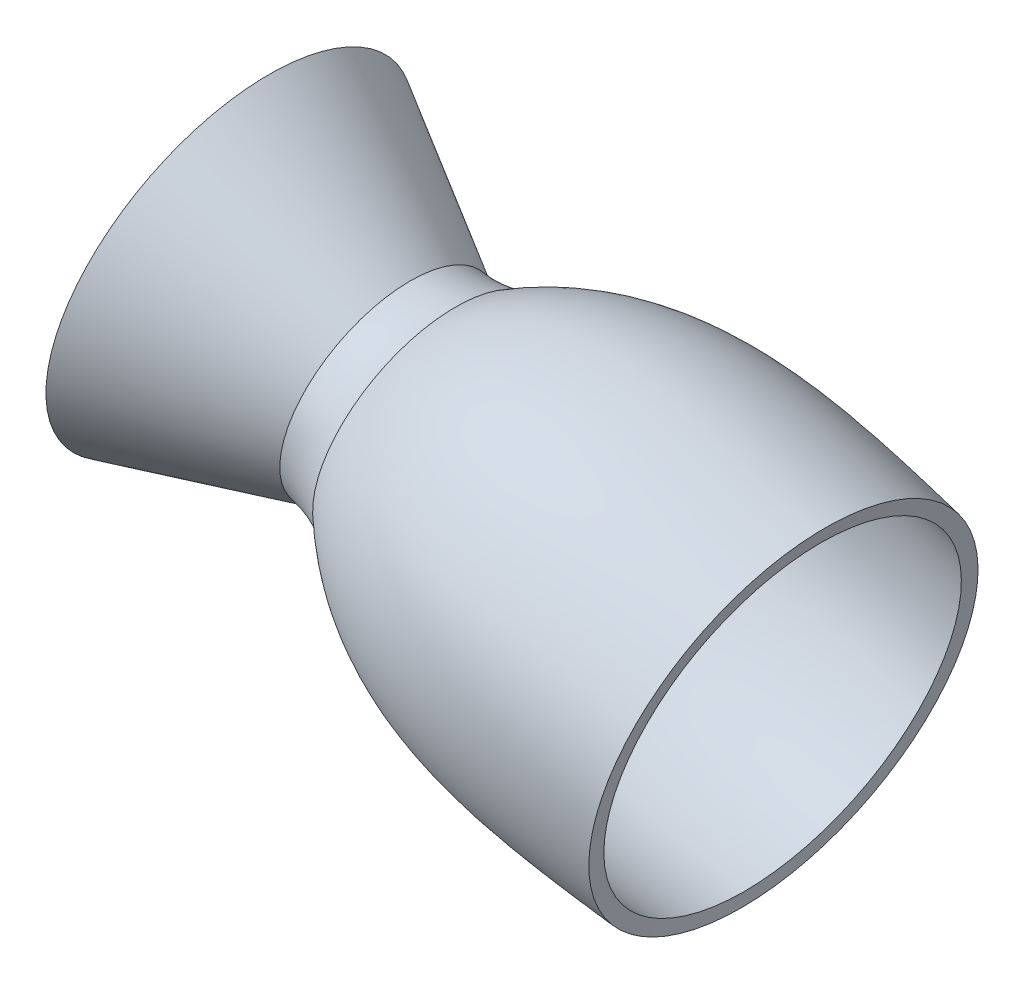
ISO-10303-21;
HEADER;
FILE_DESCRIPTION(('STEP AP214'),'2;1');
FILE_NAME('part.step','',(''),(''),'','','');
FILE_SCHEMA(('AUTOMOTIVE_DESIGN { 1 0 10303 214 1 1 1 1 }'));
ENDSEC;
DATA;
#1=APPLICATION_CONTEXT('core data for automotive mechanical design processes');
#2=APPLICATION_PROTOCOL_DEFINITION('international standard','automotive_design',2000,#1);
#3=PRODUCT_CONTEXT('',#1,'mechanical');
#4=PRODUCT('Part','Part','',(#3));
#5=PRODUCT_RELATED_PRODUCT_CATEGORY('part','',(#4));
#6=PRODUCT_DEFINITION_FORMATION('','',#4);
#7=PRODUCT_DEFINITION_CONTEXT('part definition',#1,'design');
#8=PRODUCT_DEFINITION('design','',#6,#7);
#9=PRODUCT_DEFINITION_SHAPE('','',#8);
#10=(LENGTH_UNIT() NAMED_UNIT(*) SI_UNIT(.MILLI.,.METRE.));
#11=(NAMED_UNIT(*) PLANE_ANGLE_UNIT() SI_UNIT($,.RADIAN.));
#12=(NAMED_UNIT(*) SI_UNIT($,.STERADIAN.) SOLID_ANGLE_UNIT());
#13=UNCERTAINTY_MEASURE_WITH_UNIT(LENGTH_MEASURE(1.E-05),#10,'distance_accuracy_value','');
#14=(GEOMETRIC_REPRESENTATION_CONTEXT(3) GLOBAL_UNCERTAINTY_ASSIGNED_CONTEXT((#13)) GLOBAL_UNIT_ASSIGNED_CONTEXT((#10,
#11,#12)) REPRESENTATION_CONTEXT('',''));
#15=CARTESIAN_POINT('',(0.,0.,0.));
#16=DIRECTION('',(0.,0.,1.));
#17=DIRECTION('',(1.,0.,0.));
#18=AXIS2_PLACEMENT_3D('',#15,#16,#17);
#19=CARTESIAN_POINT('',(357.166240612997,64.8337648435883,0.));
#20=CARTESIAN_POINT('',(241.601433893116,97.48957870662,0.));
#21=CARTESIAN_POINT('',(117.631064711217,135.248700164566,0.));
#22=CARTESIAN_POINT('',(0.,70.9462140020141,0.));
#23=B_SPLINE_CURVE_WITH_KNOTS('',3,(#19,#20,#21,#22),.UNSPECIFIED.,.F.,.F.,(4,4),(0.,1.),.UNSPECIFIED.);
#24=CARTESIAN_POINT('',(-43.7162211532344,-32.9540549735975,0.));
#25=DIRECTION('',(-0.975482644393373,0.220076374214298,0.));
#26=AXIS1_PLACEMENT('',#24,#25);
#27=SURFACE_OF_REVOLUTION('',#23,#26);
#28=CARTESIAN_POINT('',(-24.4227151854875,-37.3068180531541,0.));
#29=DIRECTION('',(-0.975482644393373,0.220076374214298,0.));
#30=DIRECTION('',(-0.220076374214298,-0.975482644393373,0.));
#31=AXIS2_PLACEMENT_3D('',#28,#29,#30);
#32=CIRCLE('',#31,110.973816579267);
#33=CARTESIAN_POINT('',(-48.8454303709751,-145.559850108322,0.));
#34=VERTEX_POINT('',#33);
#35=EDGE_CURVE('E10',#34,#34,#32,.T.);
#36=ORIENTED_EDGE('',*,*,#35,.F.);
#37=EDGE_LOOP('',(#36));
#38=FACE_BOUND('',#37,.T.);
#39=CARTESIAN_POINT('',(316.756899613553,-114.279558688122,0.));
#40=DIRECTION('',(-0.975482644393373,0.220076374214298,0.));
#41=DIRECTION('',(-0.220076374214298,-0.975482644393373,0.));
#42=AXIS2_PLACEMENT_3D('',#39,#40,#41);
#43=CIRCLE('',#42,183.615079736346);
#44=CARTESIAN_POINT('',(276.347558614109,-293.392882219833,0.));
#45=VERTEX_POINT('',#44);
#46=EDGE_CURVE('E68',#45,#45,#43,.T.);
#47=ORIENTED_EDGE('',*,*,#46,.T.);
#48=EDGE_LOOP('',(#47));
#49=FACE_BOUND('',#48,.T.);
#50=ADVANCED_FACE('F39',(#38,#49),#27,.T.);
#51=CARTESIAN_POINT('',(-67.6400050198666,-27.5566656493322,0.));
#52=DIRECTION('',(-0.975482644393373,0.220076374214298,0.));
#53=DIRECTION('',(-0.220076374214298,-0.975482644393373,0.));
#54=AXIS2_PLACEMENT_3D('',#51,#52,#53);
#55=TOROIDAL_SURFACE('',#54,208.027302370356,106.68729407351);
#56=CARTESIAN_POINT('',(-66.0216019114091,-27.9217898165058,0.));
#57=DIRECTION('',(-0.975482644393373,0.220076374214298,0.));
#58=DIRECTION('',(-0.220076374214298,-0.975482644393373,0.));
#59=AXIS2_PLACEMENT_3D('',#56,#57,#58);
#60=CIRCLE('',#59,101.352909133512);
#61=CARTESIAN_POINT('',(-88.3269826695838,-126.789793635026,0.));
#62=VERTEX_POINT('',#61);
#63=EDGE_CURVE('E46',#62,#62,#60,.T.);
#64=ORIENTED_EDGE('',*,*,#63,.F.);
#65=EDGE_LOOP('',(#64));
#66=FACE_BOUND('',#65,.T.);
#67=ORIENTED_EDGE('',*,*,#35,.T.);
#68=EDGE_LOOP('',(#67));
#69=FACE_BOUND('',#68,.T.);
#70=ADVANCED_FACE('F101',(#66,#69),#55,.F.);
#71=CARTESIAN_POINT('',(-66.0216019114091,-27.9217898165058,0.));
#72=DIRECTION('',(-0.975482644393373,0.220076374214298,0.));
#73=DIRECTION('',(-0.220076374214298,-0.975482644393373,0.));
#74=AXIS2_PLACEMENT_3D('',#71,#72,#73);
#75=CONICAL_SURFACE('',#74,101.352909133512,0.431133967888308);
#76=CARTESIAN_POINT('',(-218.331775078066,6.44055466919725,0.));
#77=DIRECTION('',(-0.975482644393373,0.220076374214298,0.));
#78=DIRECTION('',(-0.220076374214298,-0.975482644393373,0.));
#79=AXIS2_PLACEMENT_3D('',#76,#77,#78);
#80=CIRCLE('',#79,173.175610734498);
#81=CARTESIAN_POINT('',(-256.443635590861,-162.489248034528,0.));
#82=VERTEX_POINT('',#81);
#83=EDGE_CURVE('E50',#82,#82,#80,.T.);
#84=ORIENTED_EDGE('',*,*,#83,.F.);
#85=EDGE_LOOP('',(#84));
#86=FACE_BOUND('',#85,.T.);
#87=ORIENTED_EDGE('',*,*,#63,.T.);
#88=EDGE_LOOP('',(#87));
#89=FACE_BOUND('',#88,.T.);
#90=ADVANCED_FACE('F98',(#86,#89),#75,.T.);
#91=CARTESIAN_POINT('',(-218.331775078066,6.44055466919725,0.));
#92=DIRECTION('',(-0.975482644393373,0.220076374214298,0.));
#93=DIRECTION('',(-0.220076374214298,-0.975482644393373,0.));
#94=AXIS2_PLACEMENT_3D('',#91,#92,#93);
#95=CONICAL_SURFACE('',#94,173.175610734498,1.34890356321897);
#96=CARTESIAN_POINT('',(-215.597300053309,5.82363610863985,0.));
#97=DIRECTION('',(-0.975482644393373,0.220076374214298,0.));
#98=DIRECTION('',(-0.220076374214298,-0.975482644393373,0.));
#99=AXIS2_PLACEMENT_3D('',#96,#97,#98);
#100=CIRCLE('',#99,160.75049225225);
#101=CARTESIAN_POINT('',(-250.974685541348,-150.985679161121,0.));
#102=VERTEX_POINT('',#101);
#103=EDGE_CURVE('E54',#102,#102,#100,.T.);
#104=ORIENTED_EDGE('',*,*,#103,.F.);
#105=EDGE_LOOP('',(#104));
#106=FACE_BOUND('',#105,.T.);
#107=ORIENTED_EDGE('',*,*,#83,.T.);
#108=EDGE_LOOP('',(#107));
#109=FACE_BOUND('',#108,.T.);
#110=ADVANCED_FACE('F94',(#106,#109),#95,.F.);
#111=CARTESIAN_POINT('',(-215.597300053309,5.82363610863985,0.));
#112=DIRECTION('',(-0.975482644393373,0.220076374214298,0.));
#113=DIRECTION('',(-0.220076374214298,-0.975482644393373,0.));
#114=AXIS2_PLACEMENT_3D('',#111,#112,#113);
#115=CONICAL_SURFACE('',#114,160.75049225225,0.428064671549618);
#116=CARTESIAN_POINT('',(-63.429374934418,-28.5066161253239,0.));
#117=DIRECTION('',(-0.975482644393373,0.220076374214298,0.));
#118=DIRECTION('',(-0.220076374214298,-0.975482644393373,0.));
#119=AXIS2_PLACEMENT_3D('',#116,#117,#118);
#120=CIRCLE('',#119,89.5741482999352);
#121=CARTESIAN_POINT('',(-83.1425287156016,-115.884643178229,0.));
#122=VERTEX_POINT('',#121);
#123=EDGE_CURVE('E59',#122,#122,#120,.T.);
#124=ORIENTED_EDGE('',*,*,#123,.F.);
#125=EDGE_LOOP('',(#124));
#126=FACE_BOUND('',#125,.T.);
#127=ORIENTED_EDGE('',*,*,#103,.T.);
#128=EDGE_LOOP('',(#127));
#129=FACE_BOUND('',#128,.T.);
#130=ADVANCED_FACE('F90',(#126,#129),#115,.F.);
#131=CARTESIAN_POINT('',(-46.2562181670999,-32.381012145476,0.));
#132=DIRECTION('',(-0.975482644393373,0.220076374214298,0.));
#133=DIRECTION('',(-0.220076374214298,-0.975482644393373,0.));
#134=AXIS2_PLACEMENT_3D('',#131,#132,#133);
#135=TOROIDAL_SURFACE('',#134,130.785378197496,44.8139903104539);
#136=CARTESIAN_POINT('',(-14.7507363832661,-39.4888907312325,0.));
#137=DIRECTION('',(-0.975482644393373,0.220076374214298,0.));
#138=DIRECTION('',(-0.220076374214298,-0.975482644393373,0.));
#139=AXIS2_PLACEMENT_3D('',#136,#137,#138);
#140=CIRCLE('',#139,99.7180898201025);
#141=CARTESIAN_POINT('',(-36.69633203445,-136.762156682802,0.));
#142=VERTEX_POINT('',#141);
#143=EDGE_CURVE('E62',#142,#142,#140,.T.);
#144=ORIENTED_EDGE('',*,*,#143,.F.);
#145=EDGE_LOOP('',(#144));
#146=FACE_BOUND('',#145,.T.);
#147=ORIENTED_EDGE('',*,*,#123,.T.);
#148=EDGE_LOOP('',(#147));
#149=FACE_BOUND('',#148,.T.);
#150=ADVANCED_FACE('F86',(#146,#149),#135,.T.);
#151=CARTESIAN_POINT('',(7.19485926791774,57.784375220337,0.));
#152=CARTESIAN_POINT('',(8.92887285187381,58.7322658541738,0.));
#153=CARTESIAN_POINT('',(12.4305947065824,60.5975956751654,0.));
#154=CARTESIAN_POINT('',(19.4073751046233,64.1217819798447,0.));
#155=CARTESIAN_POINT('',(28.153172212532,68.1874132590994,0.));
#156=CARTESIAN_POINT('',(38.6660503927991,72.5315417248514,0.));
#157=CARTESIAN_POINT('',(52.7177885842323,77.6431803455462,0.));
#158=CARTESIAN_POINT('',(70.3482250302173,82.8055525408865,0.));
#159=CARTESIAN_POINT('',(91.6248763708568,87.192047226766,0.));
#160=CARTESIAN_POINT('',(113.029883127887,89.9154342571809,0.));
#161=CARTESIAN_POINT('',(141.741547579784,91.5157933235632,0.));
#162=CARTESIAN_POINT('',(177.93756146667,90.0509235845373,0.));
#163=CARTESIAN_POINT('',(221.722629230212,83.8554797670868,0.));
#164=CARTESIAN_POINT('',(265.659372360165,74.3708183137359,0.));
#165=CARTESIAN_POINT('',(302.216165626053,64.7221487170917,0.));
#166=CARTESIAN_POINT('',(331.352600515829,56.5619886775758,0.));
#167=CARTESIAN_POINT('',(345.834640132663,52.4484325945234,0.));
#168=CARTESIAN_POINT('',(353.087325703049,50.3989994087985,0.));
#169=B_SPLINE_CURVE_WITH_KNOTS('',3,(#151,#152,#153,#154,#155,#156,#157,#158,#159,#160,#161,
#162,#163,#164,#165,#166,#167,#168),.UNSPECIFIED.,.F.,.F.,(4,1,1,1,1,1,1,1,1,1,1,1,1,1,1,4),(0.,
0.015625,0.03125,0.0625,0.09375,0.125,0.1875,0.25,0.3125,0.375,0.5,0.625,0.75,0.875,0.9375,1.),.UNSPECIFIED.);
#170=CARTESIAN_POINT('',(-43.7162211532344,-32.9540549735975,0.));
#171=DIRECTION('',(-0.975482644393373,0.220076374214298,0.));
#172=AXIS1_PLACEMENT('',#170,#171);
#173=SURFACE_OF_REVOLUTION('',#169,#172);
#174=CARTESIAN_POINT('',(315.974406589081,-114.103022253913,0.));
#175=DIRECTION('',(-0.975482644393373,0.220076374214298,0.));
#176=DIRECTION('',(-0.220076374214298,-0.975482644393373,0.));
#177=AXIS2_PLACEMENT_3D('',#174,#175,#176);
#178=CIRCLE('',#177,168.636543774709);
#179=CARTESIAN_POINT('',(278.861487475112,-278.605043916625,0.));
#180=VERTEX_POINT('',#179);
#181=EDGE_CURVE('E65',#180,#180,#178,.T.);
#182=ORIENTED_EDGE('',*,*,#181,.F.);
#183=EDGE_LOOP('',(#182));
#184=FACE_BOUND('',#183,.T.);
#185=ORIENTED_EDGE('',*,*,#143,.T.);
#186=EDGE_LOOP('',(#185));
#187=FACE_BOUND('',#186,.T.);
#188=ADVANCED_FACE('F81',(#184,#187),#173,.T.);
#189=CARTESIAN_POINT('',(315.974406589081,-114.103022253913,0.));
#190=DIRECTION('',(0.975482644393373,-0.220076374214298,0.));
#191=DIRECTION('',(0.220076374214298,0.975482644393373,0.));
#192=AXIS2_PLACEMENT_3D('',#189,#190,#191);
#193=CONICAL_SURFACE('',#192,168.636543774709,1.51729348043925);
#194=ORIENTED_EDGE('',*,*,#46,.F.);
#195=EDGE_LOOP('',(#194));
#196=FACE_BOUND('',#195,.T.);
#197=ORIENTED_EDGE('',*,*,#181,.T.);
#198=EDGE_LOOP('',(#197));
#199=FACE_BOUND('',#198,.T.);
#200=ADVANCED_FACE('F85',(#196,#199),#193,.F.);
#201=CLOSED_SHELL('',(#50,#70,#90,#110,#130,#150,#188,#200));
#202=MANIFOLD_SOLID_BREP('B2',#201);
#203=ADVANCED_BREP_SHAPE_REPRESENTATION('',(#18,#202),#14);
#204=SHAPE_DEFINITION_REPRESENTATION(#9,#203);
ENDSEC;
END-ISO-10303-21;
